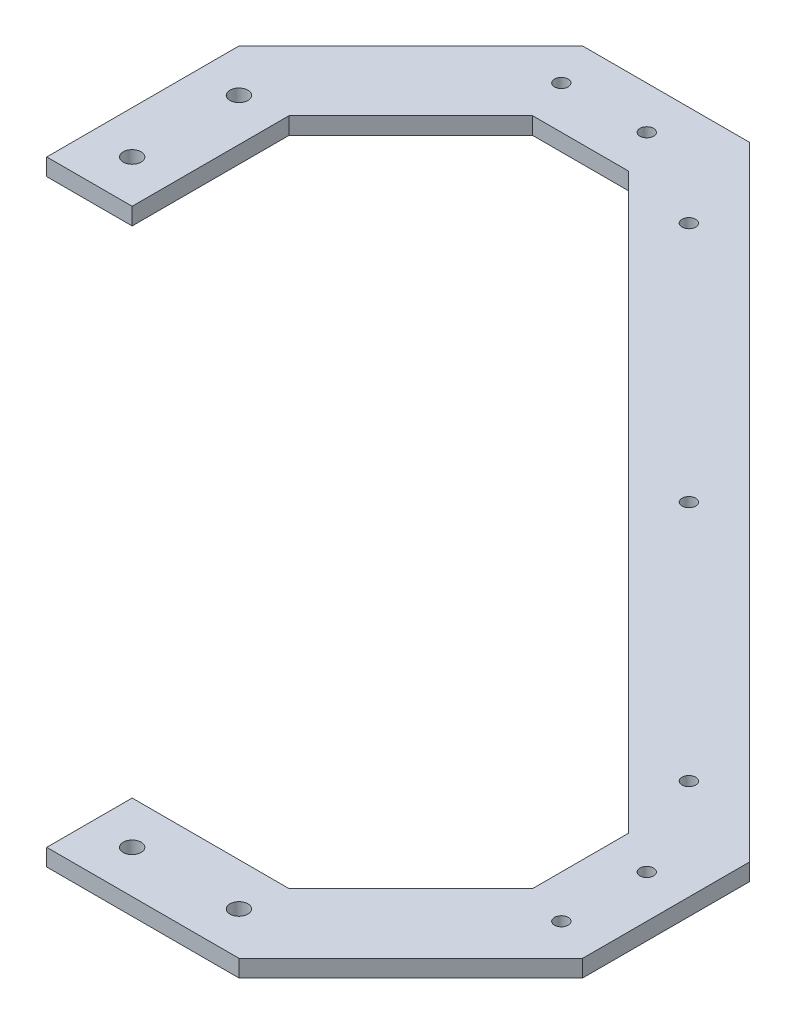
ISO-10303-21;
HEADER;
FILE_DESCRIPTION(('STEP AP214'),'2;1');
FILE_NAME('part.step','',(''),(''),'','','');
FILE_SCHEMA(('AUTOMOTIVE_DESIGN { 1 0 10303 214 1 1 1 1 }'));
ENDSEC;
DATA;
#1=APPLICATION_CONTEXT('core data for automotive mechanical design processes');
#2=APPLICATION_PROTOCOL_DEFINITION('international standard','automotive_design',2000,#1);
#3=PRODUCT_CONTEXT('',#1,'mechanical');
#4=PRODUCT('Part','Part','',(#3));
#5=PRODUCT_RELATED_PRODUCT_CATEGORY('part','',(#4));
#6=PRODUCT_DEFINITION_FORMATION('','',#4);
#7=PRODUCT_DEFINITION_CONTEXT('part definition',#1,'design');
#8=PRODUCT_DEFINITION('design','',#6,#7);
#9=PRODUCT_DEFINITION_SHAPE('','',#8);
#10=(LENGTH_UNIT() NAMED_UNIT(*) SI_UNIT(.MILLI.,.METRE.));
#11=(NAMED_UNIT(*) PLANE_ANGLE_UNIT() SI_UNIT($,.RADIAN.));
#12=(NAMED_UNIT(*) SI_UNIT($,.STERADIAN.) SOLID_ANGLE_UNIT());
#13=UNCERTAINTY_MEASURE_WITH_UNIT(LENGTH_MEASURE(1.E-05),#10,'distance_accuracy_value','');
#14=(GEOMETRIC_REPRESENTATION_CONTEXT(3) GLOBAL_UNCERTAINTY_ASSIGNED_CONTEXT((#13)) GLOBAL_UNIT_ASSIGNED_CONTEXT((#10,
#11,#12)) REPRESENTATION_CONTEXT('',''));
#15=CARTESIAN_POINT('',(0.,0.,0.));
#16=DIRECTION('',(0.,0.,1.));
#17=DIRECTION('',(1.,0.,0.));
#18=AXIS2_PLACEMENT_3D('',#15,#16,#17);
#19=CARTESIAN_POINT('',(0.,4.,0.));
#20=DIRECTION('',(0.,-1.,0.));
#21=DIRECTION('',(0.,0.,-1.));
#22=AXIS2_PLACEMENT_3D('',#19,#20,#21);
#23=PLANE('',#22);
#24=CARTESIAN_POINT('',(215.25,4.,94.7500000000009));
#25=DIRECTION('',(0.,1.,0.));
#26=DIRECTION('',(0.,0.,1.));
#27=AXIS2_PLACEMENT_3D('',#24,#25,#26);
#28=CIRCLE('',#27,1.59999999999999);
#29=CARTESIAN_POINT('',(215.25,4.,96.3500000000008));
#30=VERTEX_POINT('',#29);
#31=EDGE_CURVE('E260',#30,#30,#28,.T.);
#32=ORIENTED_EDGE('',*,*,#31,.F.);
#33=EDGE_LOOP('',(#32));
#34=FACE_BOUND('',#33,.T.);
#35=CARTESIAN_POINT('',(215.25,4.,74.7500000000008));
#36=DIRECTION('',(0.,1.,0.));
#37=DIRECTION('',(0.,0.,1.));
#38=AXIS2_PLACEMENT_3D('',#35,#36,#37);
#39=CIRCLE('',#38,1.59999999999999);
#40=CARTESIAN_POINT('',(215.25,4.,76.3500000000008));
#41=VERTEX_POINT('',#40);
#42=EDGE_CURVE('E404',#41,#41,#39,.T.);
#43=ORIENTED_EDGE('',*,*,#42,.F.);
#44=EDGE_LOOP('',(#43));
#45=FACE_BOUND('',#44,.T.);
#46=CARTESIAN_POINT('',(201.747474683058,4.,51.3896103067899));
#47=DIRECTION('',(0.,1.,0.));
#48=DIRECTION('',(0.,0.,1.));
#49=AXIS2_PLACEMENT_3D('',#46,#47,#48);
#50=CIRCLE('',#49,1.59999999999999);
#51=CARTESIAN_POINT('',(201.747474683058,4.,52.9896103067899));
#52=VERTEX_POINT('',#51);
#53=EDGE_CURVE('E410',#52,#52,#50,.T.);
#54=ORIENTED_EDGE('',*,*,#53,.F.);
#55=EDGE_LOOP('',(#54));
#56=FACE_BOUND('',#55,.T.);
#57=CARTESIAN_POINT('',(145.178932188134,4.,-5.17893218813403));
#58=DIRECTION('',(0.,1.,0.));
#59=DIRECTION('',(0.,0.,1.));
#60=AXIS2_PLACEMENT_3D('',#57,#58,#59);
#61=CIRCLE('',#60,1.59999999999999);
#62=CARTESIAN_POINT('',(145.178932188134,4.,-3.57893218813404));
#63=VERTEX_POINT('',#62);
#64=EDGE_CURVE('E415',#63,#63,#61,.T.);
#65=ORIENTED_EDGE('',*,*,#64,.F.);
#66=EDGE_LOOP('',(#65));
#67=FACE_BOUND('',#66,.T.);
#68=CARTESIAN_POINT('',(88.6103896932104,4.,-61.7474746830578));
#69=DIRECTION('',(0.,1.,0.));
#70=DIRECTION('',(0.,0.,-1.));
#71=AXIS2_PLACEMENT_3D('',#68,#69,#70);
#72=CIRCLE('',#71,1.59999999999998);
#73=CARTESIAN_POINT('',(88.6103896932104,4.,-63.3474746830577));
#74=VERTEX_POINT('',#73);
#75=EDGE_CURVE('E414',#74,#74,#72,.T.);
#76=ORIENTED_EDGE('',*,*,#75,.F.);
#77=EDGE_LOOP('',(#76));
#78=FACE_BOUND('',#77,.T.);
#79=CARTESIAN_POINT('',(65.2499999999995,4.,-75.2499999999995));
#80=DIRECTION('',(0.,1.,0.));
#81=DIRECTION('',(0.,0.,-1.));
#82=AXIS2_PLACEMENT_3D('',#79,#80,#81);
#83=CIRCLE('',#82,1.6);
#84=CARTESIAN_POINT('',(65.2499999999995,4.,-76.8499999999995));
#85=VERTEX_POINT('',#84);
#86=EDGE_CURVE('E420',#85,#85,#83,.T.);
#87=ORIENTED_EDGE('',*,*,#86,.F.);
#88=EDGE_LOOP('',(#87));
#89=FACE_BOUND('',#88,.T.);
#90=CARTESIAN_POINT('',(45.2499999999995,4.,-75.2499999999995));
#91=DIRECTION('',(0.,1.,0.));
#92=DIRECTION('',(0.,0.,-1.));
#93=AXIS2_PLACEMENT_3D('',#90,#91,#92);
#94=CIRCLE('',#93,1.6);
#95=CARTESIAN_POINT('',(45.2499999999995,4.,-76.8499999999995));
#96=VERTEX_POINT('',#95);
#97=EDGE_CURVE('E417',#96,#96,#94,.T.);
#98=ORIENTED_EDGE('',*,*,#97,.F.);
#99=EDGE_LOOP('',(#98));
#100=FACE_BOUND('',#99,.T.);
#101=DIRECTION('',(0.,0.,1.));
#102=VECTOR('',#101,1.);
#103=CARTESIAN_POINT('',(0.,4.,0.));
#104=LINE('',#103,#102);
#105=CARTESIAN_POINT('',(0.,4.,-45.));
#106=VERTEX_POINT('',#105);
#107=CARTESIAN_POINT('',(0.,4.,0.));
#108=VERTEX_POINT('',#107);
#109=EDGE_CURVE('E220',#106,#108,#104,.T.);
#110=ORIENTED_EDGE('',*,*,#109,.T.);
#111=DIRECTION('',(1.,0.,0.));
#112=VECTOR('',#111,1.);
#113=CARTESIAN_POINT('',(20.,4.,0.));
#114=LINE('',#113,#112);
#115=CARTESIAN_POINT('',(20.,4.,0.));
#116=VERTEX_POINT('',#115);
#117=EDGE_CURVE('E123',#108,#116,#114,.T.);
#118=ORIENTED_EDGE('',*,*,#117,.T.);
#119=DIRECTION('',(0.,0.,-1.));
#120=VECTOR('',#119,1.);
#121=CARTESIAN_POINT('',(20.,4.,-36.7157287525381));
#122=LINE('',#121,#120);
#123=CARTESIAN_POINT('',(20.,4.,-36.7157287525381));
#124=VERTEX_POINT('',#123);
#125=EDGE_CURVE('E302',#116,#124,#122,.T.);
#126=ORIENTED_EDGE('',*,*,#125,.T.);
#127=DIRECTION('',(0.707106781186548,0.,-0.707106781186547));
#128=VECTOR('',#127,1.);
#129=CARTESIAN_POINT('',(48.5342712474616,4.,-65.2499999999997));
#130=LINE('',#129,#128);
#131=CARTESIAN_POINT('',(48.5342712474616,4.,-65.2499999999997));
#132=VERTEX_POINT('',#131);
#133=EDGE_CURVE('E306',#124,#132,#130,.T.);
#134=ORIENTED_EDGE('',*,*,#133,.T.);
#135=DIRECTION('',(1.,0.,0.));
#136=VECTOR('',#135,1.);
#137=CARTESIAN_POINT('',(48.5342712474616,4.,-65.2499999999997));
#138=LINE('',#137,#136);
#139=CARTESIAN_POINT('',(70.9657287525379,4.,-65.2499999999997));
#140=VERTEX_POINT('',#139);
#141=EDGE_CURVE('E308',#132,#140,#138,.T.);
#142=ORIENTED_EDGE('',*,*,#141,.T.);
#143=DIRECTION('',(0.707106781186547,0.,0.707106781186549));
#144=VECTOR('',#143,1.);
#145=CARTESIAN_POINT('',(70.9657287525379,4.,-65.2499999999997));
#146=LINE('',#145,#144);
#147=CARTESIAN_POINT('',(205.25,4.,69.0342712474625));
#148=VERTEX_POINT('',#147);
#149=EDGE_CURVE('E309',#140,#148,#146,.T.);
#150=ORIENTED_EDGE('',*,*,#149,.T.);
#151=DIRECTION('',(0.,0.,1.));
#152=VECTOR('',#151,1.);
#153=CARTESIAN_POINT('',(205.25,4.,91.4657287525388));
#154=LINE('',#153,#152);
#155=CARTESIAN_POINT('',(205.25,4.,91.4657287525388));
#156=VERTEX_POINT('',#155);
#157=EDGE_CURVE('E315',#148,#156,#154,.T.);
#158=ORIENTED_EDGE('',*,*,#157,.T.);
#159=DIRECTION('',(-0.707106781186549,0.,0.707106781186546));
#160=VECTOR('',#159,1.);
#161=CARTESIAN_POINT('',(205.25,4.,91.4657287525388));
#162=LINE('',#161,#160);
#163=CARTESIAN_POINT('',(176.715728752538,4.,120.));
#164=VERTEX_POINT('',#163);
#165=EDGE_CURVE('E313',#156,#164,#162,.T.);
#166=ORIENTED_EDGE('',*,*,#165,.T.);
#167=DIRECTION('',(-1.,0.,0.));
#168=VECTOR('',#167,1.);
#169=CARTESIAN_POINT('',(176.715728752538,4.,120.));
#170=LINE('',#169,#168);
#171=CARTESIAN_POINT('',(140.,4.,120.));
#172=VERTEX_POINT('',#171);
#173=EDGE_CURVE('E317',#164,#172,#170,.T.);
#174=ORIENTED_EDGE('',*,*,#173,.T.);
#175=DIRECTION('',(0.,0.,1.));
#176=VECTOR('',#175,1.);
#177=CARTESIAN_POINT('',(140.,4.,120.));
#178=LINE('',#177,#176);
#179=CARTESIAN_POINT('',(140.,4.,140.));
#180=VERTEX_POINT('',#179);
#181=EDGE_CURVE('E319',#172,#180,#178,.T.);
#182=ORIENTED_EDGE('',*,*,#181,.T.);
#183=DIRECTION('',(1.,0.,0.));
#184=VECTOR('',#183,1.);
#185=CARTESIAN_POINT('',(140.,4.,140.));
#186=LINE('',#185,#184);
#187=CARTESIAN_POINT('',(185.,4.,140.));
#188=VERTEX_POINT('',#187);
#189=EDGE_CURVE('E318',#180,#188,#186,.T.);
#190=ORIENTED_EDGE('',*,*,#189,.T.);
#191=DIRECTION('',(0.70710678118655,0.,-0.707106781186545));
#192=VECTOR('',#191,1.);
#193=CARTESIAN_POINT('',(185.,4.,140.));
#194=LINE('',#193,#192);
#195=CARTESIAN_POINT('',(225.25,4.,99.7500000000009));
#196=VERTEX_POINT('',#195);
#197=EDGE_CURVE('E325',#188,#196,#194,.T.);
#198=ORIENTED_EDGE('',*,*,#197,.T.);
#199=DIRECTION('',(0.,0.,-1.));
#200=VECTOR('',#199,1.);
#201=CARTESIAN_POINT('',(225.25,4.,99.7500000000009));
#202=LINE('',#201,#200);
#203=CARTESIAN_POINT('',(225.25,4.,60.7500000000007));
#204=VERTEX_POINT('',#203);
#205=EDGE_CURVE('E166',#196,#204,#202,.T.);
#206=ORIENTED_EDGE('',*,*,#205,.T.);
#207=DIRECTION('',(-0.707106781186546,0.,-0.707106781186549));
#208=VECTOR('',#207,1.);
#209=CARTESIAN_POINT('',(79.2499999999998,4.,-85.2499999999997));
#210=LINE('',#209,#208);
#211=CARTESIAN_POINT('',(79.2499999999998,4.,-85.2499999999997));
#212=VERTEX_POINT('',#211);
#213=EDGE_CURVE('E162',#204,#212,#210,.T.);
#214=ORIENTED_EDGE('',*,*,#213,.T.);
#215=DIRECTION('',(-1.,0.,0.));
#216=VECTOR('',#215,1.);
#217=CARTESIAN_POINT('',(40.2499999999997,4.,-85.2499999999997));
#218=LINE('',#217,#216);
#219=CARTESIAN_POINT('',(40.2499999999997,4.,-85.2499999999997));
#220=VERTEX_POINT('',#219);
#221=EDGE_CURVE('E168',#212,#220,#218,.T.);
#222=ORIENTED_EDGE('',*,*,#221,.T.);
#223=DIRECTION('',(-0.707106781186548,0.,0.707106781186548));
#224=VECTOR('',#223,1.);
#225=CARTESIAN_POINT('',(0.,4.,-45.));
#226=LINE('',#225,#224);
#227=EDGE_CURVE('E59',#220,#106,#226,.T.);
#228=ORIENTED_EDGE('',*,*,#227,.T.);
#229=EDGE_LOOP('',(#110,#118,#126,#134,#142,#150,#158,#166,#174,#182,#190,#198,#206,#214,#222,#228));
#230=FACE_BOUND('',#229,.T.);
#231=CARTESIAN_POINT('',(10.,4.,-10.));
#232=DIRECTION('',(0.,1.,0.));
#233=DIRECTION('',(0.,0.,1.));
#234=AXIS2_PLACEMENT_3D('',#231,#232,#233);
#235=CIRCLE('',#234,2.1);
#236=CARTESIAN_POINT('',(10.,4.,-7.9));
#237=VERTEX_POINT('',#236);
#238=EDGE_CURVE('E188',#237,#237,#235,.T.);
#239=ORIENTED_EDGE('',*,*,#238,.F.);
#240=EDGE_LOOP('',(#239));
#241=FACE_BOUND('',#240,.T.);
#242=CARTESIAN_POINT('',(10.,4.,-35.));
#243=DIRECTION('',(0.,1.,0.));
#244=DIRECTION('',(0.,0.,-1.));
#245=AXIS2_PLACEMENT_3D('',#242,#243,#244);
#246=CIRCLE('',#245,2.1);
#247=CARTESIAN_POINT('',(10.,4.,-37.1));
#248=VERTEX_POINT('',#247);
#249=EDGE_CURVE('E292',#248,#248,#246,.T.);
#250=ORIENTED_EDGE('',*,*,#249,.F.);
#251=EDGE_LOOP('',(#250));
#252=FACE_BOUND('',#251,.T.);
#253=CARTESIAN_POINT('',(175.,4.,130.));
#254=DIRECTION('',(0.,1.,0.));
#255=DIRECTION('',(0.,0.,1.));
#256=AXIS2_PLACEMENT_3D('',#253,#254,#255);
#257=CIRCLE('',#256,2.09999999999998);
#258=CARTESIAN_POINT('',(175.,4.,132.1));
#259=VERTEX_POINT('',#258);
#260=EDGE_CURVE('E289',#259,#259,#257,.T.);
#261=ORIENTED_EDGE('',*,*,#260,.F.);
#262=EDGE_LOOP('',(#261));
#263=FACE_BOUND('',#262,.T.);
#264=CARTESIAN_POINT('',(150.,4.,130.));
#265=DIRECTION('',(0.,1.,0.));
#266=DIRECTION('',(0.,0.,-1.));
#267=AXIS2_PLACEMENT_3D('',#264,#265,#266);
#268=CIRCLE('',#267,2.10000000000002);
#269=CARTESIAN_POINT('',(150.,4.,127.9));
#270=VERTEX_POINT('',#269);
#271=EDGE_CURVE('E280',#270,#270,#268,.T.);
#272=ORIENTED_EDGE('',*,*,#271,.F.);
#273=EDGE_LOOP('',(#272));
#274=FACE_BOUND('',#273,.T.);
#275=ADVANCED_FACE('F39',(#34,#45,#56,#67,#78,#89,#100,#230,#241,#252,#263,#274),#23,.F.);
#276=CARTESIAN_POINT('',(0.,0.,0.));
#277=DIRECTION('',(0.,-1.,0.));
#278=DIRECTION('',(0.,0.,-1.));
#279=AXIS2_PLACEMENT_3D('',#276,#277,#278);
#280=PLANE('',#279);
#281=CARTESIAN_POINT('',(215.25,0.,94.7500000000009));
#282=DIRECTION('',(0.,-1.,0.));
#283=DIRECTION('',(0.,0.,-1.));
#284=AXIS2_PLACEMENT_3D('',#281,#282,#283);
#285=CIRCLE('',#284,1.59999999999999);
#286=CARTESIAN_POINT('',(215.25,0.,93.1500000000009));
#287=VERTEX_POINT('',#286);
#288=EDGE_CURVE('E43',#287,#287,#285,.T.);
#289=ORIENTED_EDGE('',*,*,#288,.F.);
#290=EDGE_LOOP('',(#289));
#291=FACE_BOUND('',#290,.T.);
#292=CARTESIAN_POINT('',(215.25,0.,74.7500000000008));
#293=DIRECTION('',(0.,-1.,0.));
#294=DIRECTION('',(0.,0.,-1.));
#295=AXIS2_PLACEMENT_3D('',#292,#293,#294);
#296=CIRCLE('',#295,1.59999999999999);
#297=CARTESIAN_POINT('',(215.25,0.,73.1500000000009));
#298=VERTEX_POINT('',#297);
#299=EDGE_CURVE('E270',#298,#298,#296,.T.);
#300=ORIENTED_EDGE('',*,*,#299,.F.);
#301=EDGE_LOOP('',(#300));
#302=FACE_BOUND('',#301,.T.);
#303=CARTESIAN_POINT('',(201.747474683058,0.,51.3896103067899));
#304=DIRECTION('',(0.,-1.,0.));
#305=DIRECTION('',(0.,0.,-1.));
#306=AXIS2_PLACEMENT_3D('',#303,#304,#305);
#307=CIRCLE('',#306,1.59999999999999);
#308=CARTESIAN_POINT('',(201.747474683058,0.,49.7896103067899));
#309=VERTEX_POINT('',#308);
#310=EDGE_CURVE('E269',#309,#309,#307,.T.);
#311=ORIENTED_EDGE('',*,*,#310,.F.);
#312=EDGE_LOOP('',(#311));
#313=FACE_BOUND('',#312,.T.);
#314=CARTESIAN_POINT('',(145.178932188134,0.,-5.17893218813403));
#315=DIRECTION('',(0.,-1.,0.));
#316=DIRECTION('',(0.,0.,-1.));
#317=AXIS2_PLACEMENT_3D('',#314,#315,#316);
#318=CIRCLE('',#317,1.59999999999999);
#319=CARTESIAN_POINT('',(145.178932188134,0.,-6.77893218813402));
#320=VERTEX_POINT('',#319);
#321=EDGE_CURVE('E262',#320,#320,#318,.T.);
#322=ORIENTED_EDGE('',*,*,#321,.F.);
#323=EDGE_LOOP('',(#322));
#324=FACE_BOUND('',#323,.T.);
#325=CARTESIAN_POINT('',(88.6103896932104,0.,-61.7474746830578));
#326=DIRECTION('',(0.,-1.,0.));
#327=DIRECTION('',(0.,0.,-1.));
#328=AXIS2_PLACEMENT_3D('',#325,#326,#327);
#329=CIRCLE('',#328,1.59999999999998);
#330=CARTESIAN_POINT('',(88.6103896932104,0.,-63.3474746830577));
#331=VERTEX_POINT('',#330);
#332=EDGE_CURVE('E258',#331,#331,#329,.T.);
#333=ORIENTED_EDGE('',*,*,#332,.F.);
#334=EDGE_LOOP('',(#333));
#335=FACE_BOUND('',#334,.T.);
#336=CARTESIAN_POINT('',(65.2499999999995,0.,-75.2499999999995));
#337=DIRECTION('',(0.,-1.,0.));
#338=DIRECTION('',(0.,0.,-1.));
#339=AXIS2_PLACEMENT_3D('',#336,#337,#338);
#340=CIRCLE('',#339,1.6);
#341=CARTESIAN_POINT('',(65.2499999999995,0.,-76.8499999999995));
#342=VERTEX_POINT('',#341);
#343=EDGE_CURVE('E257',#342,#342,#340,.T.);
#344=ORIENTED_EDGE('',*,*,#343,.F.);
#345=EDGE_LOOP('',(#344));
#346=FACE_BOUND('',#345,.T.);
#347=CARTESIAN_POINT('',(45.2499999999995,0.,-75.2499999999995));
#348=DIRECTION('',(0.,-1.,0.));
#349=DIRECTION('',(0.,0.,-1.));
#350=AXIS2_PLACEMENT_3D('',#347,#348,#349);
#351=CIRCLE('',#350,1.6);
#352=CARTESIAN_POINT('',(45.2499999999995,0.,-76.8499999999995));
#353=VERTEX_POINT('',#352);
#354=EDGE_CURVE('E254',#353,#353,#351,.T.);
#355=ORIENTED_EDGE('',*,*,#354,.F.);
#356=EDGE_LOOP('',(#355));
#357=FACE_BOUND('',#356,.T.);
#358=CARTESIAN_POINT('',(175.,0.,130.));
#359=DIRECTION('',(0.,1.,0.));
#360=DIRECTION('',(0.,0.,1.));
#361=AXIS2_PLACEMENT_3D('',#358,#359,#360);
#362=CIRCLE('',#361,2.09999999999998);
#363=CARTESIAN_POINT('',(175.,0.,132.1));
#364=VERTEX_POINT('',#363);
#365=EDGE_CURVE('E285',#364,#364,#362,.T.);
#366=ORIENTED_EDGE('',*,*,#365,.T.);
#367=EDGE_LOOP('',(#366));
#368=FACE_BOUND('',#367,.T.);
#369=CARTESIAN_POINT('',(10.,0.,-10.));
#370=DIRECTION('',(0.,1.,0.));
#371=DIRECTION('',(0.,0.,1.));
#372=AXIS2_PLACEMENT_3D('',#369,#370,#371);
#373=CIRCLE('',#372,2.1);
#374=CARTESIAN_POINT('',(10.,0.,-7.9));
#375=VERTEX_POINT('',#374);
#376=EDGE_CURVE('E294',#375,#375,#373,.T.);
#377=ORIENTED_EDGE('',*,*,#376,.T.);
#378=EDGE_LOOP('',(#377));
#379=FACE_BOUND('',#378,.T.);
#380=DIRECTION('',(0.,0.,1.));
#381=VECTOR('',#380,1.);
#382=CARTESIAN_POINT('',(0.,0.,0.));
#383=LINE('',#382,#381);
#384=CARTESIAN_POINT('',(0.,0.,-45.));
#385=VERTEX_POINT('',#384);
#386=CARTESIAN_POINT('',(0.,0.,0.));
#387=VERTEX_POINT('',#386);
#388=EDGE_CURVE('E187',#385,#387,#383,.T.);
#389=ORIENTED_EDGE('',*,*,#388,.F.);
#390=DIRECTION('',(-0.707106781186548,0.,0.707106781186548));
#391=VECTOR('',#390,1.);
#392=CARTESIAN_POINT('',(0.,0.,-45.));
#393=LINE('',#392,#391);
#394=CARTESIAN_POINT('',(40.2499999999997,0.,-85.2499999999997));
#395=VERTEX_POINT('',#394);
#396=EDGE_CURVE('E120',#395,#385,#393,.T.);
#397=ORIENTED_EDGE('',*,*,#396,.F.);
#398=DIRECTION('',(-1.,0.,0.));
#399=VECTOR('',#398,1.);
#400=CARTESIAN_POINT('',(40.2499999999997,0.,-85.2499999999997));
#401=LINE('',#400,#399);
#402=CARTESIAN_POINT('',(79.2499999999998,0.,-85.2499999999997));
#403=VERTEX_POINT('',#402);
#404=EDGE_CURVE('E111',#403,#395,#401,.T.);
#405=ORIENTED_EDGE('',*,*,#404,.F.);
#406=DIRECTION('',(-0.707106781186546,0.,-0.707106781186549));
#407=VECTOR('',#406,1.);
#408=CARTESIAN_POINT('',(79.2499999999998,0.,-85.2499999999997));
#409=LINE('',#408,#407);
#410=CARTESIAN_POINT('',(225.25,0.,60.7500000000007));
#411=VERTEX_POINT('',#410);
#412=EDGE_CURVE('E176',#411,#403,#409,.T.);
#413=ORIENTED_EDGE('',*,*,#412,.F.);
#414=DIRECTION('',(0.,0.,-1.));
#415=VECTOR('',#414,1.);
#416=CARTESIAN_POINT('',(225.25,0.,99.7500000000009));
#417=LINE('',#416,#415);
#418=CARTESIAN_POINT('',(225.25,0.,99.7500000000009));
#419=VERTEX_POINT('',#418);
#420=EDGE_CURVE('E215',#419,#411,#417,.T.);
#421=ORIENTED_EDGE('',*,*,#420,.F.);
#422=DIRECTION('',(0.70710678118655,0.,-0.707106781186545));
#423=VECTOR('',#422,1.);
#424=CARTESIAN_POINT('',(185.,0.,140.));
#425=LINE('',#424,#423);
#426=CARTESIAN_POINT('',(185.,0.,140.));
#427=VERTEX_POINT('',#426);
#428=EDGE_CURVE('E208',#427,#419,#425,.T.);
#429=ORIENTED_EDGE('',*,*,#428,.F.);
#430=DIRECTION('',(1.,0.,0.));
#431=VECTOR('',#430,1.);
#432=CARTESIAN_POINT('',(140.,0.,140.));
#433=LINE('',#432,#431);
#434=CARTESIAN_POINT('',(140.,0.,140.));
#435=VERTEX_POINT('',#434);
#436=EDGE_CURVE('E206',#435,#427,#433,.T.);
#437=ORIENTED_EDGE('',*,*,#436,.F.);
#438=DIRECTION('',(0.,0.,1.));
#439=VECTOR('',#438,1.);
#440=CARTESIAN_POINT('',(140.,0.,120.));
#441=LINE('',#440,#439);
#442=CARTESIAN_POINT('',(140.,0.,120.));
#443=VERTEX_POINT('',#442);
#444=EDGE_CURVE('E207',#443,#435,#441,.T.);
#445=ORIENTED_EDGE('',*,*,#444,.F.);
#446=DIRECTION('',(-1.,0.,0.));
#447=VECTOR('',#446,1.);
#448=CARTESIAN_POINT('',(176.715728752538,0.,120.));
#449=LINE('',#448,#447);
#450=CARTESIAN_POINT('',(176.715728752538,0.,120.));
#451=VERTEX_POINT('',#450);
#452=EDGE_CURVE('E203',#451,#443,#449,.T.);
#453=ORIENTED_EDGE('',*,*,#452,.F.);
#454=DIRECTION('',(-0.707106781186549,0.,0.707106781186546));
#455=VECTOR('',#454,1.);
#456=CARTESIAN_POINT('',(205.25,0.,91.4657287525388));
#457=LINE('',#456,#455);
#458=CARTESIAN_POINT('',(205.25,0.,91.4657287525388));
#459=VERTEX_POINT('',#458);
#460=EDGE_CURVE('E201',#459,#451,#457,.T.);
#461=ORIENTED_EDGE('',*,*,#460,.F.);
#462=DIRECTION('',(0.,0.,1.));
#463=VECTOR('',#462,1.);
#464=CARTESIAN_POINT('',(205.25,0.,91.4657287525388));
#465=LINE('',#464,#463);
#466=CARTESIAN_POINT('',(205.25,0.,69.0342712474625));
#467=VERTEX_POINT('',#466);
#468=EDGE_CURVE('E199',#467,#459,#465,.T.);
#469=ORIENTED_EDGE('',*,*,#468,.F.);
#470=DIRECTION('',(0.707106781186547,0.,0.707106781186549));
#471=VECTOR('',#470,1.);
#472=CARTESIAN_POINT('',(70.9657287525379,0.,-65.2499999999997));
#473=LINE('',#472,#471);
#474=CARTESIAN_POINT('',(70.9657287525379,0.,-65.2499999999997));
#475=VERTEX_POINT('',#474);
#476=EDGE_CURVE('E197',#475,#467,#473,.T.);
#477=ORIENTED_EDGE('',*,*,#476,.F.);
#478=DIRECTION('',(1.,0.,0.));
#479=VECTOR('',#478,1.);
#480=CARTESIAN_POINT('',(48.5342712474616,0.,-65.2499999999997));
#481=LINE('',#480,#479);
#482=CARTESIAN_POINT('',(48.5342712474616,0.,-65.2499999999997));
#483=VERTEX_POINT('',#482);
#484=EDGE_CURVE('E196',#483,#475,#481,.T.);
#485=ORIENTED_EDGE('',*,*,#484,.F.);
#486=DIRECTION('',(0.707106781186548,0.,-0.707106781186547));
#487=VECTOR('',#486,1.);
#488=CARTESIAN_POINT('',(48.5342712474616,0.,-65.2499999999997));
#489=LINE('',#488,#487);
#490=CARTESIAN_POINT('',(20.,0.,-36.7157287525381));
#491=VERTEX_POINT('',#490);
#492=EDGE_CURVE('E191',#491,#483,#489,.T.);
#493=ORIENTED_EDGE('',*,*,#492,.F.);
#494=DIRECTION('',(0.,0.,-1.));
#495=VECTOR('',#494,1.);
#496=CARTESIAN_POINT('',(20.,0.,-36.7157287525381));
#497=LINE('',#496,#495);
#498=CARTESIAN_POINT('',(20.,0.,0.));
#499=VERTEX_POINT('',#498);
#500=EDGE_CURVE('E195',#499,#491,#497,.T.);
#501=ORIENTED_EDGE('',*,*,#500,.F.);
#502=DIRECTION('',(1.,0.,0.));
#503=VECTOR('',#502,1.);
#504=CARTESIAN_POINT('',(20.,0.,0.));
#505=LINE('',#504,#503);
#506=EDGE_CURVE('E186',#387,#499,#505,.T.);
#507=ORIENTED_EDGE('',*,*,#506,.F.);
#508=EDGE_LOOP('',(#389,#397,#405,#413,#421,#429,#437,#445,#453,#461,#469,#477,#485,#493,#501,#507));
#509=FACE_BOUND('',#508,.T.);
#510=CARTESIAN_POINT('',(10.,0.,-35.));
#511=DIRECTION('',(0.,1.,0.));
#512=DIRECTION('',(0.,0.,-1.));
#513=AXIS2_PLACEMENT_3D('',#510,#511,#512);
#514=CIRCLE('',#513,2.1);
#515=CARTESIAN_POINT('',(10.,0.,-37.1));
#516=VERTEX_POINT('',#515);
#517=EDGE_CURVE('E288',#516,#516,#514,.T.);
#518=ORIENTED_EDGE('',*,*,#517,.T.);
#519=EDGE_LOOP('',(#518));
#520=FACE_BOUND('',#519,.T.);
#521=CARTESIAN_POINT('',(150.,0.,130.));
#522=DIRECTION('',(0.,1.,0.));
#523=DIRECTION('',(0.,0.,-1.));
#524=AXIS2_PLACEMENT_3D('',#521,#522,#523);
#525=CIRCLE('',#524,2.10000000000002);
#526=CARTESIAN_POINT('',(150.,0.,127.9));
#527=VERTEX_POINT('',#526);
#528=EDGE_CURVE('E271',#527,#527,#525,.T.);
#529=ORIENTED_EDGE('',*,*,#528,.T.);
#530=EDGE_LOOP('',(#529));
#531=FACE_BOUND('',#530,.T.);
#532=ADVANCED_FACE('F332',(#291,#302,#313,#324,#335,#346,#357,#368,#379,#509,#520,#531),#280,.T.);
#533=CARTESIAN_POINT('',(0.,4.,0.));
#534=DIRECTION('',(1.,0.,0.));
#535=DIRECTION('',(0.,0.,-1.));
#536=AXIS2_PLACEMENT_3D('',#533,#534,#535);
#537=PLANE('',#536);
#538=ORIENTED_EDGE('',*,*,#388,.T.);
#539=DIRECTION('',(0.,-1.,0.));
#540=VECTOR('',#539,1.);
#541=CARTESIAN_POINT('',(0.,4.,0.));
#542=LINE('',#541,#540);
#543=EDGE_CURVE('E11',#108,#387,#542,.T.);
#544=ORIENTED_EDGE('',*,*,#543,.F.);
#545=ORIENTED_EDGE('',*,*,#109,.F.);
#546=DIRECTION('',(0.,-1.,0.));
#547=VECTOR('',#546,1.);
#548=CARTESIAN_POINT('',(0.,4.,-45.));
#549=LINE('',#548,#547);
#550=EDGE_CURVE('E185',#106,#385,#549,.T.);
#551=ORIENTED_EDGE('',*,*,#550,.T.);
#552=EDGE_LOOP('',(#538,#544,#545,#551));
#553=FACE_BOUND('',#552,.T.);
#554=ADVANCED_FACE('F41',(#553),#537,.F.);
#555=CARTESIAN_POINT('',(20.,4.,0.));
#556=DIRECTION('',(0.,0.,-1.));
#557=DIRECTION('',(-1.,0.,0.));
#558=AXIS2_PLACEMENT_3D('',#555,#556,#557);
#559=PLANE('',#558);
#560=ORIENTED_EDGE('',*,*,#506,.T.);
#561=DIRECTION('',(0.,-1.,0.));
#562=VECTOR('',#561,1.);
#563=CARTESIAN_POINT('',(20.,4.,0.));
#564=LINE('',#563,#562);
#565=EDGE_CURVE('E47',#116,#499,#564,.T.);
#566=ORIENTED_EDGE('',*,*,#565,.F.);
#567=ORIENTED_EDGE('',*,*,#117,.F.);
#568=ORIENTED_EDGE('',*,*,#543,.T.);
#569=EDGE_LOOP('',(#560,#566,#567,#568));
#570=FACE_BOUND('',#569,.T.);
#571=ADVANCED_FACE('F486',(#570),#559,.F.);
#572=CARTESIAN_POINT('',(20.,4.,-36.7157287525381));
#573=DIRECTION('',(-1.,0.,0.));
#574=DIRECTION('',(0.,0.,1.));
#575=AXIS2_PLACEMENT_3D('',#572,#573,#574);
#576=PLANE('',#575);
#577=ORIENTED_EDGE('',*,*,#500,.T.);
#578=DIRECTION('',(0.,-1.,0.));
#579=VECTOR('',#578,1.);
#580=CARTESIAN_POINT('',(20.,4.,-36.7157287525381));
#581=LINE('',#580,#579);
#582=EDGE_CURVE('E247',#124,#491,#581,.T.);
#583=ORIENTED_EDGE('',*,*,#582,.F.);
#584=ORIENTED_EDGE('',*,*,#125,.F.);
#585=ORIENTED_EDGE('',*,*,#565,.T.);
#586=EDGE_LOOP('',(#577,#583,#584,#585));
#587=FACE_BOUND('',#586,.T.);
#588=ADVANCED_FACE('F496',(#587),#576,.F.);
#589=CARTESIAN_POINT('',(48.5342712474616,4.,-65.2499999999997));
#590=DIRECTION('',(-0.707106781186547,0.,-0.707106781186548));
#591=DIRECTION('',(-0.707106781186548,0.,0.707106781186547));
#592=AXIS2_PLACEMENT_3D('',#589,#590,#591);
#593=PLANE('',#592);
#594=ORIENTED_EDGE('',*,*,#492,.T.);
#595=DIRECTION('',(0.,-1.,0.));
#596=VECTOR('',#595,1.);
#597=CARTESIAN_POINT('',(48.5342712474616,4.,-65.2499999999997));
#598=LINE('',#597,#596);
#599=EDGE_CURVE('E244',#132,#483,#598,.T.);
#600=ORIENTED_EDGE('',*,*,#599,.F.);
#601=ORIENTED_EDGE('',*,*,#133,.F.);
#602=ORIENTED_EDGE('',*,*,#582,.T.);
#603=EDGE_LOOP('',(#594,#600,#601,#602));
#604=FACE_BOUND('',#603,.T.);
#605=ADVANCED_FACE('F502',(#604),#593,.F.);
#606=CARTESIAN_POINT('',(48.5342712474616,4.,-65.2499999999997));
#607=DIRECTION('',(0.,0.,-1.));
#608=DIRECTION('',(-1.,0.,0.));
#609=AXIS2_PLACEMENT_3D('',#606,#607,#608);
#610=PLANE('',#609);
#611=ORIENTED_EDGE('',*,*,#484,.T.);
#612=DIRECTION('',(0.,-1.,0.));
#613=VECTOR('',#612,1.);
#614=CARTESIAN_POINT('',(70.9657287525379,4.,-65.2499999999997));
#615=LINE('',#614,#613);
#616=EDGE_CURVE('E245',#140,#475,#615,.T.);
#617=ORIENTED_EDGE('',*,*,#616,.F.);
#618=ORIENTED_EDGE('',*,*,#141,.F.);
#619=ORIENTED_EDGE('',*,*,#599,.T.);
#620=EDGE_LOOP('',(#611,#617,#618,#619));
#621=FACE_BOUND('',#620,.T.);
#622=ADVANCED_FACE('F511',(#621),#610,.F.);
#623=CARTESIAN_POINT('',(70.9657287525379,4.,-65.2499999999997));
#624=DIRECTION('',(0.707106781186549,0.,-0.707106781186547));
#625=DIRECTION('',(-0.707106781186546,0.,-0.707106781186549));
#626=AXIS2_PLACEMENT_3D('',#623,#624,#625);
#627=PLANE('',#626);
#628=ORIENTED_EDGE('',*,*,#476,.T.);
#629=DIRECTION('',(0.,-1.,0.));
#630=VECTOR('',#629,1.);
#631=CARTESIAN_POINT('',(205.25,4.,69.0342712474625));
#632=LINE('',#631,#630);
#633=EDGE_CURVE('E237',#148,#467,#632,.T.);
#634=ORIENTED_EDGE('',*,*,#633,.F.);
#635=ORIENTED_EDGE('',*,*,#149,.F.);
#636=ORIENTED_EDGE('',*,*,#616,.T.);
#637=EDGE_LOOP('',(#628,#634,#635,#636));
#638=FACE_BOUND('',#637,.T.);
#639=ADVANCED_FACE('F523',(#638),#627,.F.);
#640=CARTESIAN_POINT('',(205.25,4.,91.4657287525388));
#641=DIRECTION('',(1.,0.,0.));
#642=DIRECTION('',(0.,0.,-1.));
#643=AXIS2_PLACEMENT_3D('',#640,#641,#642);
#644=PLANE('',#643);
#645=ORIENTED_EDGE('',*,*,#468,.T.);
#646=DIRECTION('',(0.,-1.,0.));
#647=VECTOR('',#646,1.);
#648=CARTESIAN_POINT('',(205.25,4.,91.4657287525388));
#649=LINE('',#648,#647);
#650=EDGE_CURVE('E236',#156,#459,#649,.T.);
#651=ORIENTED_EDGE('',*,*,#650,.F.);
#652=ORIENTED_EDGE('',*,*,#157,.F.);
#653=ORIENTED_EDGE('',*,*,#633,.T.);
#654=EDGE_LOOP('',(#645,#651,#652,#653));
#655=FACE_BOUND('',#654,.T.);
#656=ADVANCED_FACE('F534',(#655),#644,.F.);
#657=CARTESIAN_POINT('',(205.25,4.,91.4657287525388));
#658=DIRECTION('',(0.707106781186546,0.,0.707106781186549));
#659=DIRECTION('',(0.707106781186549,0.,-0.707106781186546));
#660=AXIS2_PLACEMENT_3D('',#657,#658,#659);
#661=PLANE('',#660);
#662=ORIENTED_EDGE('',*,*,#460,.T.);
#663=DIRECTION('',(0.,-1.,0.));
#664=VECTOR('',#663,1.);
#665=CARTESIAN_POINT('',(176.715728752538,4.,120.));
#666=LINE('',#665,#664);
#667=EDGE_CURVE('E231',#164,#451,#666,.T.);
#668=ORIENTED_EDGE('',*,*,#667,.F.);
#669=ORIENTED_EDGE('',*,*,#165,.F.);
#670=ORIENTED_EDGE('',*,*,#650,.T.);
#671=EDGE_LOOP('',(#662,#668,#669,#670));
#672=FACE_BOUND('',#671,.T.);
#673=ADVANCED_FACE('F543',(#672),#661,.F.);
#674=CARTESIAN_POINT('',(176.715728752538,4.,120.));
#675=DIRECTION('',(0.,0.,1.));
#676=DIRECTION('',(1.,0.,0.));
#677=AXIS2_PLACEMENT_3D('',#674,#675,#676);
#678=PLANE('',#677);
#679=ORIENTED_EDGE('',*,*,#452,.T.);
#680=DIRECTION('',(0.,-1.,0.));
#681=VECTOR('',#680,1.);
#682=CARTESIAN_POINT('',(140.,4.,120.));
#683=LINE('',#682,#681);
#684=EDGE_CURVE('E229',#172,#443,#683,.T.);
#685=ORIENTED_EDGE('',*,*,#684,.F.);
#686=ORIENTED_EDGE('',*,*,#173,.F.);
#687=ORIENTED_EDGE('',*,*,#667,.T.);
#688=EDGE_LOOP('',(#679,#685,#686,#687));
#689=FACE_BOUND('',#688,.T.);
#690=ADVANCED_FACE('F555',(#689),#678,.F.);
#691=CARTESIAN_POINT('',(140.,4.,120.));
#692=DIRECTION('',(1.,0.,0.));
#693=DIRECTION('',(0.,0.,-1.));
#694=AXIS2_PLACEMENT_3D('',#691,#692,#693);
#695=PLANE('',#694);
#696=ORIENTED_EDGE('',*,*,#444,.T.);
#697=DIRECTION('',(0.,-1.,0.));
#698=VECTOR('',#697,1.);
#699=CARTESIAN_POINT('',(140.,4.,140.));
#700=LINE('',#699,#698);
#701=EDGE_CURVE('E227',#180,#435,#700,.T.);
#702=ORIENTED_EDGE('',*,*,#701,.F.);
#703=ORIENTED_EDGE('',*,*,#181,.F.);
#704=ORIENTED_EDGE('',*,*,#684,.T.);
#705=EDGE_LOOP('',(#696,#702,#703,#704));
#706=FACE_BOUND('',#705,.T.);
#707=ADVANCED_FACE('F562',(#706),#695,.F.);
#708=CARTESIAN_POINT('',(140.,4.,140.));
#709=DIRECTION('',(0.,0.,-1.));
#710=DIRECTION('',(-1.,0.,0.));
#711=AXIS2_PLACEMENT_3D('',#708,#709,#710);
#712=PLANE('',#711);
#713=ORIENTED_EDGE('',*,*,#436,.T.);
#714=DIRECTION('',(0.,-1.,0.));
#715=VECTOR('',#714,1.);
#716=CARTESIAN_POINT('',(185.,4.,140.));
#717=LINE('',#716,#715);
#718=EDGE_CURVE('E223',#188,#427,#717,.T.);
#719=ORIENTED_EDGE('',*,*,#718,.F.);
#720=ORIENTED_EDGE('',*,*,#189,.F.);
#721=ORIENTED_EDGE('',*,*,#701,.T.);
#722=EDGE_LOOP('',(#713,#719,#720,#721));
#723=FACE_BOUND('',#722,.T.);
#724=ADVANCED_FACE('F573',(#723),#712,.F.);
#725=CARTESIAN_POINT('',(185.,4.,140.));
#726=DIRECTION('',(-0.707106781186545,0.,-0.70710678118655));
#727=DIRECTION('',(-0.70710678118655,0.,0.707106781186545));
#728=AXIS2_PLACEMENT_3D('',#725,#726,#727);
#729=PLANE('',#728);
#730=ORIENTED_EDGE('',*,*,#428,.T.);
#731=DIRECTION('',(0.,-1.,0.));
#732=VECTOR('',#731,1.);
#733=CARTESIAN_POINT('',(225.25,4.,99.7500000000009));
#734=LINE('',#733,#732);
#735=EDGE_CURVE('E224',#196,#419,#734,.T.);
#736=ORIENTED_EDGE('',*,*,#735,.F.);
#737=ORIENTED_EDGE('',*,*,#197,.F.);
#738=ORIENTED_EDGE('',*,*,#718,.T.);
#739=EDGE_LOOP('',(#730,#736,#737,#738));
#740=FACE_BOUND('',#739,.T.);
#741=ADVANCED_FACE('F327',(#740),#729,.F.);
#742=CARTESIAN_POINT('',(225.25,4.,99.7500000000009));
#743=DIRECTION('',(-1.,0.,0.));
#744=DIRECTION('',(0.,0.,1.));
#745=AXIS2_PLACEMENT_3D('',#742,#743,#744);
#746=PLANE('',#745);
#747=ORIENTED_EDGE('',*,*,#420,.T.);
#748=DIRECTION('',(0.,-1.,0.));
#749=VECTOR('',#748,1.);
#750=CARTESIAN_POINT('',(225.25,4.,60.7500000000007));
#751=LINE('',#750,#749);
#752=EDGE_CURVE('E180',#204,#411,#751,.T.);
#753=ORIENTED_EDGE('',*,*,#752,.F.);
#754=ORIENTED_EDGE('',*,*,#205,.F.);
#755=ORIENTED_EDGE('',*,*,#735,.T.);
#756=EDGE_LOOP('',(#747,#753,#754,#755));
#757=FACE_BOUND('',#756,.T.);
#758=ADVANCED_FACE('F331',(#757),#746,.F.);
#759=CARTESIAN_POINT('',(79.2499999999998,4.,-85.2499999999997));
#760=DIRECTION('',(-0.707106781186549,0.,0.707106781186546));
#761=DIRECTION('',(0.707106781186546,0.,0.707106781186549));
#762=AXIS2_PLACEMENT_3D('',#759,#760,#761);
#763=PLANE('',#762);
#764=ORIENTED_EDGE('',*,*,#412,.T.);
#765=DIRECTION('',(0.,-1.,0.));
#766=VECTOR('',#765,1.);
#767=CARTESIAN_POINT('',(79.2499999999998,4.,-85.2499999999997));
#768=LINE('',#767,#766);
#769=EDGE_CURVE('E173',#212,#403,#768,.T.);
#770=ORIENTED_EDGE('',*,*,#769,.F.);
#771=ORIENTED_EDGE('',*,*,#213,.F.);
#772=ORIENTED_EDGE('',*,*,#752,.T.);
#773=EDGE_LOOP('',(#764,#770,#771,#772));
#774=FACE_BOUND('',#773,.T.);
#775=ADVANCED_FACE('F172',(#774),#763,.F.);
#776=CARTESIAN_POINT('',(40.2499999999997,4.,-85.2499999999997));
#777=DIRECTION('',(0.,0.,1.));
#778=DIRECTION('',(1.,0.,0.));
#779=AXIS2_PLACEMENT_3D('',#776,#777,#778);
#780=PLANE('',#779);
#781=ORIENTED_EDGE('',*,*,#404,.T.);
#782=DIRECTION('',(0.,-1.,0.));
#783=VECTOR('',#782,1.);
#784=CARTESIAN_POINT('',(40.2499999999997,4.,-85.2499999999997));
#785=LINE('',#784,#783);
#786=EDGE_CURVE('E178',#220,#395,#785,.T.);
#787=ORIENTED_EDGE('',*,*,#786,.F.);
#788=ORIENTED_EDGE('',*,*,#221,.F.);
#789=ORIENTED_EDGE('',*,*,#769,.T.);
#790=EDGE_LOOP('',(#781,#787,#788,#789));
#791=FACE_BOUND('',#790,.T.);
#792=ADVANCED_FACE('F179',(#791),#780,.F.);
#793=CARTESIAN_POINT('',(0.,4.,-45.));
#794=DIRECTION('',(0.707106781186547,0.,0.707106781186548));
#795=DIRECTION('',(0.707106781186548,0.,-0.707106781186547));
#796=AXIS2_PLACEMENT_3D('',#793,#794,#795);
#797=PLANE('',#796);
#798=ORIENTED_EDGE('',*,*,#396,.T.);
#799=ORIENTED_EDGE('',*,*,#550,.F.);
#800=ORIENTED_EDGE('',*,*,#227,.F.);
#801=ORIENTED_EDGE('',*,*,#786,.T.);
#802=EDGE_LOOP('',(#798,#799,#800,#801));
#803=FACE_BOUND('',#802,.T.);
#804=ADVANCED_FACE('F342',(#803),#797,.F.);
#805=CARTESIAN_POINT('',(10.,4.,-10.));
#806=DIRECTION('',(0.,-1.,0.));
#807=DIRECTION('',(0.,0.,-1.));
#808=AXIS2_PLACEMENT_3D('',#805,#806,#807);
#809=CYLINDRICAL_SURFACE('',#808,2.1);
#810=ORIENTED_EDGE('',*,*,#238,.T.);
#811=EDGE_LOOP('',(#810));
#812=FACE_BOUND('',#811,.T.);
#813=ORIENTED_EDGE('',*,*,#376,.F.);
#814=EDGE_LOOP('',(#813));
#815=FACE_BOUND('',#814,.T.);
#816=ADVANCED_FACE('F344',(#812,#815),#809,.F.);
#817=CARTESIAN_POINT('',(10.,4.,-35.));
#818=DIRECTION('',(0.,-1.,0.));
#819=DIRECTION('',(0.,0.,-1.));
#820=AXIS2_PLACEMENT_3D('',#817,#818,#819);
#821=CYLINDRICAL_SURFACE('',#820,2.1);
#822=ORIENTED_EDGE('',*,*,#249,.T.);
#823=EDGE_LOOP('',(#822));
#824=FACE_BOUND('',#823,.T.);
#825=ORIENTED_EDGE('',*,*,#517,.F.);
#826=EDGE_LOOP('',(#825));
#827=FACE_BOUND('',#826,.T.);
#828=ADVANCED_FACE('F348',(#824,#827),#821,.F.);
#829=CARTESIAN_POINT('',(175.,4.,130.));
#830=DIRECTION('',(0.,-1.,0.));
#831=DIRECTION('',(0.,0.,-1.));
#832=AXIS2_PLACEMENT_3D('',#829,#830,#831);
#833=CYLINDRICAL_SURFACE('',#832,2.09999999999998);
#834=ORIENTED_EDGE('',*,*,#260,.T.);
#835=EDGE_LOOP('',(#834));
#836=FACE_BOUND('',#835,.T.);
#837=ORIENTED_EDGE('',*,*,#365,.F.);
#838=EDGE_LOOP('',(#837));
#839=FACE_BOUND('',#838,.T.);
#840=ADVANCED_FACE('F370',(#836,#839),#833,.F.);
#841=CARTESIAN_POINT('',(150.,4.,130.));
#842=DIRECTION('',(0.,-1.,0.));
#843=DIRECTION('',(0.,0.,-1.));
#844=AXIS2_PLACEMENT_3D('',#841,#842,#843);
#845=CYLINDRICAL_SURFACE('',#844,2.10000000000002);
#846=ORIENTED_EDGE('',*,*,#271,.T.);
#847=EDGE_LOOP('',(#846));
#848=FACE_BOUND('',#847,.T.);
#849=ORIENTED_EDGE('',*,*,#528,.F.);
#850=EDGE_LOOP('',(#849));
#851=FACE_BOUND('',#850,.T.);
#852=ADVANCED_FACE('F371',(#848,#851),#845,.F.);
#853=CARTESIAN_POINT('',(45.2499999999995,-46.,-75.2499999999995));
#854=DIRECTION('',(0.,1.,0.));
#855=DIRECTION('',(0.,0.,1.));
#856=AXIS2_PLACEMENT_3D('',#853,#854,#855);
#857=CYLINDRICAL_SURFACE('',#856,1.6);
#858=ORIENTED_EDGE('',*,*,#354,.T.);
#859=EDGE_LOOP('',(#858));
#860=FACE_BOUND('',#859,.T.);
#861=ORIENTED_EDGE('',*,*,#97,.T.);
#862=EDGE_LOOP('',(#861));
#863=FACE_BOUND('',#862,.T.);
#864=ADVANCED_FACE('F372',(#860,#863),#857,.F.);
#865=CARTESIAN_POINT('',(65.2499999999995,-46.,-75.2499999999995));
#866=DIRECTION('',(0.,1.,0.));
#867=DIRECTION('',(0.,0.,1.));
#868=AXIS2_PLACEMENT_3D('',#865,#866,#867);
#869=CYLINDRICAL_SURFACE('',#868,1.6);
#870=ORIENTED_EDGE('',*,*,#343,.T.);
#871=EDGE_LOOP('',(#870));
#872=FACE_BOUND('',#871,.T.);
#873=ORIENTED_EDGE('',*,*,#86,.T.);
#874=EDGE_LOOP('',(#873));
#875=FACE_BOUND('',#874,.T.);
#876=ADVANCED_FACE('F377',(#872,#875),#869,.F.);
#877=CARTESIAN_POINT('',(88.6103896932104,-46.,-61.7474746830578));
#878=DIRECTION('',(0.,1.,0.));
#879=DIRECTION('',(0.,0.,1.));
#880=AXIS2_PLACEMENT_3D('',#877,#878,#879);
#881=CYLINDRICAL_SURFACE('',#880,1.59999999999998);
#882=ORIENTED_EDGE('',*,*,#332,.T.);
#883=EDGE_LOOP('',(#882));
#884=FACE_BOUND('',#883,.T.);
#885=ORIENTED_EDGE('',*,*,#75,.T.);
#886=EDGE_LOOP('',(#885));
#887=FACE_BOUND('',#886,.T.);
#888=ADVANCED_FACE('F385',(#884,#887),#881,.F.);
#889=CARTESIAN_POINT('',(145.178932188134,-46.,-5.17893218813403));
#890=DIRECTION('',(0.,1.,0.));
#891=DIRECTION('',(0.,0.,1.));
#892=AXIS2_PLACEMENT_3D('',#889,#890,#891);
#893=CYLINDRICAL_SURFACE('',#892,1.59999999999999);
#894=ORIENTED_EDGE('',*,*,#321,.T.);
#895=EDGE_LOOP('',(#894));
#896=FACE_BOUND('',#895,.T.);
#897=ORIENTED_EDGE('',*,*,#64,.T.);
#898=EDGE_LOOP('',(#897));
#899=FACE_BOUND('',#898,.T.);
#900=ADVANCED_FACE('F387',(#896,#899),#893,.F.);
#901=CARTESIAN_POINT('',(201.747474683058,-46.,51.3896103067899));
#902=DIRECTION('',(0.,1.,0.));
#903=DIRECTION('',(0.,0.,1.));
#904=AXIS2_PLACEMENT_3D('',#901,#902,#903);
#905=CYLINDRICAL_SURFACE('',#904,1.59999999999999);
#906=ORIENTED_EDGE('',*,*,#310,.T.);
#907=EDGE_LOOP('',(#906));
#908=FACE_BOUND('',#907,.T.);
#909=ORIENTED_EDGE('',*,*,#53,.T.);
#910=EDGE_LOOP('',(#909));
#911=FACE_BOUND('',#910,.T.);
#912=ADVANCED_FACE('F388',(#908,#911),#905,.F.);
#913=CARTESIAN_POINT('',(215.25,-46.,74.7500000000008));
#914=DIRECTION('',(0.,1.,0.));
#915=DIRECTION('',(0.,0.,1.));
#916=AXIS2_PLACEMENT_3D('',#913,#914,#915);
#917=CYLINDRICAL_SURFACE('',#916,1.59999999999999);
#918=ORIENTED_EDGE('',*,*,#299,.T.);
#919=EDGE_LOOP('',(#918));
#920=FACE_BOUND('',#919,.T.);
#921=ORIENTED_EDGE('',*,*,#42,.T.);
#922=EDGE_LOOP('',(#921));
#923=FACE_BOUND('',#922,.T.);
#924=ADVANCED_FACE('F393',(#920,#923),#917,.F.);
#925=CARTESIAN_POINT('',(215.25,-46.,94.7500000000009));
#926=DIRECTION('',(0.,1.,0.));
#927=DIRECTION('',(0.,0.,1.));
#928=AXIS2_PLACEMENT_3D('',#925,#926,#927);
#929=CYLINDRICAL_SURFACE('',#928,1.59999999999999);
#930=ORIENTED_EDGE('',*,*,#288,.T.);
#931=EDGE_LOOP('',(#930));
#932=FACE_BOUND('',#931,.T.);
#933=ORIENTED_EDGE('',*,*,#31,.T.);
#934=EDGE_LOOP('',(#933));
#935=FACE_BOUND('',#934,.T.);
#936=ADVANCED_FACE('F400',(#932,#935),#929,.F.);
#937=CLOSED_SHELL('',(#275,#532,#554,#571,#588,#605,#622,#639,#656,#673,#690,#707,#724,#741,
#758,#775,#792,#804,#816,#828,#840,#852,#864,#876,#888,#900,#912,#924,#936));
#938=MANIFOLD_SOLID_BREP('B2',#937);
#939=ADVANCED_BREP_SHAPE_REPRESENTATION('',(#18,#938),#14);
#940=SHAPE_DEFINITION_REPRESENTATION(#9,#939);
ENDSEC;
END-ISO-10303-21;
